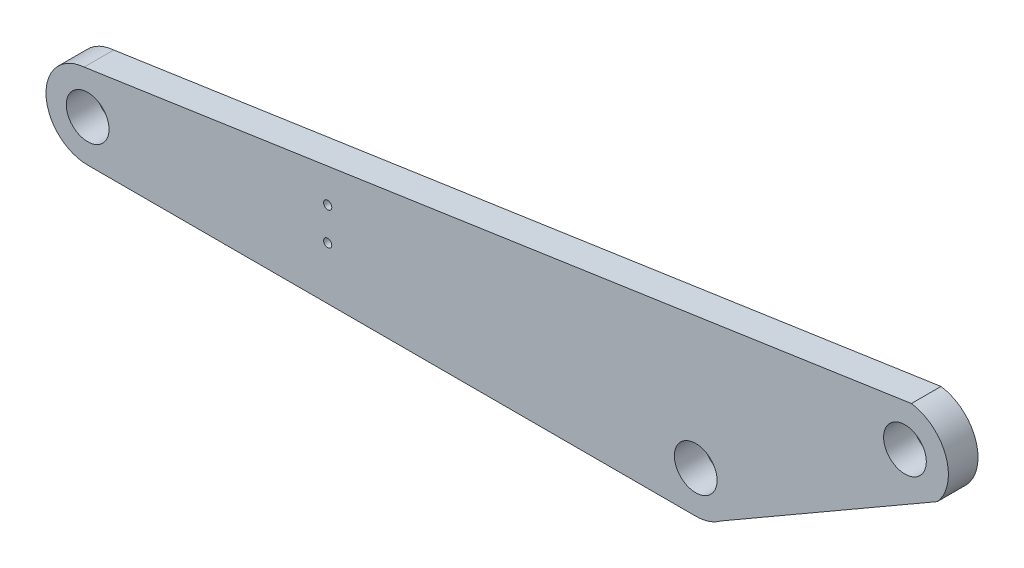
ISO-10303-21;
HEADER;
FILE_DESCRIPTION(('STEP AP214'),'2;1');
FILE_NAME('part.step','',(''),(''),'','','');
FILE_SCHEMA(('AUTOMOTIVE_DESIGN { 1 0 10303 214 1 1 1 1 }'));
ENDSEC;
DATA;
#1=APPLICATION_CONTEXT('core data for automotive mechanical design processes');
#2=APPLICATION_PROTOCOL_DEFINITION('international standard','automotive_design',2000,#1);
#3=PRODUCT_CONTEXT('',#1,'mechanical');
#4=PRODUCT('Part','Part','',(#3));
#5=PRODUCT_RELATED_PRODUCT_CATEGORY('part','',(#4));
#6=PRODUCT_DEFINITION_FORMATION('','',#4);
#7=PRODUCT_DEFINITION_CONTEXT('part definition',#1,'design');
#8=PRODUCT_DEFINITION('design','',#6,#7);
#9=PRODUCT_DEFINITION_SHAPE('','',#8);
#10=(LENGTH_UNIT() NAMED_UNIT(*) SI_UNIT(.MILLI.,.METRE.));
#11=(NAMED_UNIT(*) PLANE_ANGLE_UNIT() SI_UNIT($,.RADIAN.));
#12=(NAMED_UNIT(*) SI_UNIT($,.STERADIAN.) SOLID_ANGLE_UNIT());
#13=UNCERTAINTY_MEASURE_WITH_UNIT(LENGTH_MEASURE(1.E-05),#10,'distance_accuracy_value','');
#14=(GEOMETRIC_REPRESENTATION_CONTEXT(3) GLOBAL_UNCERTAINTY_ASSIGNED_CONTEXT((#13)) GLOBAL_UNIT_ASSIGNED_CONTEXT((#10,
#11,#12)) REPRESENTATION_CONTEXT('',''));
#15=CARTESIAN_POINT('',(0.,0.,0.));
#16=DIRECTION('',(0.,0.,1.));
#17=DIRECTION('',(1.,0.,0.));
#18=AXIS2_PLACEMENT_3D('',#15,#16,#17);
#19=CARTESIAN_POINT('',(127.305734356312,73.5000000000002,18.));
#20=DIRECTION('',(0.,0.,1.));
#21=DIRECTION('',(1.,0.,0.));
#22=AXIS2_PLACEMENT_3D('',#19,#20,#21);
#23=PLANE('',#22);
#24=CARTESIAN_POINT('',(-223.959522935687,6.65563285928387,18.));
#25=DIRECTION('',(0.,0.,1.));
#26=DIRECTION('',(1.,0.,0.));
#27=AXIS2_PLACEMENT_3D('',#24,#25,#26);
#28=CIRCLE('',#27,2.5);
#29=CARTESIAN_POINT('',(-221.459522935687,6.65563285928387,18.));
#30=VERTEX_POINT('',#29);
#31=EDGE_CURVE('E195',#30,#30,#28,.T.);
#32=ORIENTED_EDGE('',*,*,#31,.F.);
#33=EDGE_LOOP('',(#32));
#34=FACE_BOUND('',#33,.T.);
#35=CARTESIAN_POINT('',(127.305734356312,73.5000000000002,18.));
#36=DIRECTION('',(0.,0.,1.));
#37=DIRECTION('',(1.,0.,0.));
#38=AXIS2_PLACEMENT_3D('',#35,#36,#37);
#39=CIRCLE('',#38,13.);
#40=CARTESIAN_POINT('',(140.305734356312,73.5000000000002,18.));
#41=VERTEX_POINT('',#40);
#42=EDGE_CURVE('E207',#41,#41,#39,.T.);
#43=ORIENTED_EDGE('',*,*,#42,.F.);
#44=EDGE_LOOP('',(#43));
#45=FACE_BOUND('',#44,.T.);
#46=CARTESIAN_POINT('',(127.305734356312,73.5000000000002,18.));
#47=DIRECTION('',(0.,0.,1.));
#48=DIRECTION('',(1.,0.,0.));
#49=AXIS2_PLACEMENT_3D('',#46,#47,#48);
#50=CIRCLE('',#49,26.450565349214);
#51=CARTESIAN_POINT('',(146.950608565952,55.7881021745137,18.));
#52=VERTEX_POINT('',#51);
#53=CARTESIAN_POINT('',(131.250734202599,99.6547200999331,18.));
#54=VERTEX_POINT('',#53);
#55=EDGE_CURVE('E131',#52,#54,#50,.T.);
#56=ORIENTED_EDGE('',*,*,#55,.T.);
#57=DIRECTION('',(-0.989253846671343,-0.146208162719974,0.));
#58=VECTOR('',#57,1.);
#59=CARTESIAN_POINT('',(131.250734202599,99.6547200999331,18.));
#60=LINE('',#59,#58);
#61=CARTESIAN_POINT('',(-372.14308414375,25.2549231694854,18.));
#62=VERTEX_POINT('',#61);
#63=EDGE_CURVE('E89',#54,#62,#60,.T.);
#64=ORIENTED_EDGE('',*,*,#63,.T.);
#65=CARTESIAN_POINT('',(-370.,0.,18.));
#66=DIRECTION('',(0.,0.,1.));
#67=DIRECTION('',(1.,0.,0.));
#68=AXIS2_PLACEMENT_3D('',#65,#66,#67);
#69=CIRCLE('',#68,25.3456890603472);
#70=CARTESIAN_POINT('',(-369.741140616565,-25.3443671407162,18.));
#71=VERTEX_POINT('',#70);
#72=EDGE_CURVE('E102',#62,#71,#69,.T.);
#73=ORIENTED_EDGE('',*,*,#72,.T.);
#74=DIRECTION('',(1.,0.,0.));
#75=VECTOR('',#74,1.);
#76=CARTESIAN_POINT('',(-0.588044699082338,-25.3443671407161,18.));
#77=LINE('',#76,#75);
#78=CARTESIAN_POINT('',(-0.588044699082338,-25.3443671407161,18.));
#79=VERTEX_POINT('',#78);
#80=EDGE_CURVE('E96',#71,#79,#77,.T.);
#81=ORIENTED_EDGE('',*,*,#80,.T.);
#82=CARTESIAN_POINT('',(0.,0.,18.));
#83=DIRECTION('',(0.,0.,1.));
#84=DIRECTION('',(1.,0.,0.));
#85=AXIS2_PLACEMENT_3D('',#82,#83,#84);
#86=CIRCLE('',#85,25.3511881838214);
#87=CARTESIAN_POINT('',(15.2621827740877,-20.2422459055775,18.));
#88=VERTEX_POINT('',#87);
#89=EDGE_CURVE('E100',#79,#88,#86,.T.);
#90=ORIENTED_EDGE('',*,*,#89,.T.);
#91=DIRECTION('',(0.866025403784438,0.500000000000001,0.));
#92=VECTOR('',#91,1.);
#93=CARTESIAN_POINT('',(15.2621827740876,-20.2422459055775,18.));
#94=LINE('',#93,#92);
#95=EDGE_CURVE('E52',#88,#52,#94,.T.);
#96=ORIENTED_EDGE('',*,*,#95,.T.);
#97=EDGE_LOOP('',(#56,#64,#73,#81,#90,#96));
#98=FACE_BOUND('',#97,.T.);
#99=CARTESIAN_POINT('',(-370.,0.,18.));
#100=DIRECTION('',(0.,0.,1.));
#101=DIRECTION('',(1.,0.,0.));
#102=AXIS2_PLACEMENT_3D('',#99,#100,#101);
#103=CIRCLE('',#102,13.);
#104=CARTESIAN_POINT('',(-357.,0.,18.));
#105=VERTEX_POINT('',#104);
#106=EDGE_CURVE('E124',#105,#105,#103,.T.);
#107=ORIENTED_EDGE('',*,*,#106,.F.);
#108=EDGE_LOOP('',(#107));
#109=FACE_BOUND('',#108,.T.);
#110=CARTESIAN_POINT('',(0.,0.,18.));
#111=DIRECTION('',(0.,0.,1.));
#112=DIRECTION('',(1.,0.,0.));
#113=AXIS2_PLACEMENT_3D('',#110,#111,#112);
#114=CIRCLE('',#113,13.);
#115=CARTESIAN_POINT('',(13.,0.,18.));
#116=VERTEX_POINT('',#115);
#117=EDGE_CURVE('E201',#116,#116,#114,.T.);
#118=ORIENTED_EDGE('',*,*,#117,.F.);
#119=EDGE_LOOP('',(#118));
#120=FACE_BOUND('',#119,.T.);
#121=CARTESIAN_POINT('',(-223.959522935687,26.6556328592839,18.));
#122=DIRECTION('',(0.,0.,1.));
#123=DIRECTION('',(1.,0.,0.));
#124=AXIS2_PLACEMENT_3D('',#121,#122,#123);
#125=CIRCLE('',#124,2.5);
#126=CARTESIAN_POINT('',(-221.459522935687,26.6556328592839,18.));
#127=VERTEX_POINT('',#126);
#128=EDGE_CURVE('E186',#127,#127,#125,.T.);
#129=ORIENTED_EDGE('',*,*,#128,.F.);
#130=EDGE_LOOP('',(#129));
#131=FACE_BOUND('',#130,.T.);
#132=ADVANCED_FACE('F35',(#34,#45,#98,#109,#120,#131),#23,.T.);
#133=CARTESIAN_POINT('',(127.305734356312,73.5000000000002,0.));
#134=DIRECTION('',(0.,0.,1.));
#135=DIRECTION('',(1.,0.,0.));
#136=AXIS2_PLACEMENT_3D('',#133,#134,#135);
#137=PLANE('',#136);
#138=CARTESIAN_POINT('',(127.305734356312,73.5000000000002,0.));
#139=DIRECTION('',(0.,0.,1.));
#140=DIRECTION('',(1.,0.,0.));
#141=AXIS2_PLACEMENT_3D('',#138,#139,#140);
#142=CIRCLE('',#141,26.450565349214);
#143=CARTESIAN_POINT('',(146.950608565952,55.7881021745137,0.));
#144=VERTEX_POINT('',#143);
#145=CARTESIAN_POINT('',(131.250734202599,99.6547200999331,0.));
#146=VERTEX_POINT('',#145);
#147=EDGE_CURVE('E120',#144,#146,#142,.T.);
#148=ORIENTED_EDGE('',*,*,#147,.F.);
#149=DIRECTION('',(0.866025403784438,0.500000000000001,0.));
#150=VECTOR('',#149,1.);
#151=CARTESIAN_POINT('',(15.2621827740876,-20.2422459055775,0.));
#152=LINE('',#151,#150);
#153=CARTESIAN_POINT('',(15.2621827740877,-20.2422459055775,0.));
#154=VERTEX_POINT('',#153);
#155=EDGE_CURVE('E81',#154,#144,#152,.T.);
#156=ORIENTED_EDGE('',*,*,#155,.F.);
#157=CARTESIAN_POINT('',(0.,0.,0.));
#158=DIRECTION('',(0.,0.,1.));
#159=DIRECTION('',(1.,0.,0.));
#160=AXIS2_PLACEMENT_3D('',#157,#158,#159);
#161=CIRCLE('',#160,25.3511881838214);
#162=CARTESIAN_POINT('',(-0.588044699082338,-25.3443671407161,0.));
#163=VERTEX_POINT('',#162);
#164=EDGE_CURVE('E75',#163,#154,#161,.T.);
#165=ORIENTED_EDGE('',*,*,#164,.F.);
#166=DIRECTION('',(1.,0.,0.));
#167=VECTOR('',#166,1.);
#168=CARTESIAN_POINT('',(-0.588044699082338,-25.3443671407161,0.));
#169=LINE('',#168,#167);
#170=CARTESIAN_POINT('',(-369.741140616565,-25.3443671407162,0.));
#171=VERTEX_POINT('',#170);
#172=EDGE_CURVE('E110',#171,#163,#169,.T.);
#173=ORIENTED_EDGE('',*,*,#172,.F.);
#174=CARTESIAN_POINT('',(-370.,0.,0.));
#175=DIRECTION('',(0.,0.,1.));
#176=DIRECTION('',(1.,0.,0.));
#177=AXIS2_PLACEMENT_3D('',#174,#175,#176);
#178=CIRCLE('',#177,25.3456890603472);
#179=CARTESIAN_POINT('',(-372.14308414375,25.2549231694854,0.));
#180=VERTEX_POINT('',#179);
#181=EDGE_CURVE('E126',#180,#171,#178,.T.);
#182=ORIENTED_EDGE('',*,*,#181,.F.);
#183=DIRECTION('',(-0.989253846671343,-0.146208162719974,0.));
#184=VECTOR('',#183,1.);
#185=CARTESIAN_POINT('',(131.250734202599,99.6547200999331,0.));
#186=LINE('',#185,#184);
#187=EDGE_CURVE('E123',#146,#180,#186,.T.);
#188=ORIENTED_EDGE('',*,*,#187,.F.);
#189=EDGE_LOOP('',(#148,#156,#165,#173,#182,#188));
#190=FACE_BOUND('',#189,.T.);
#191=CARTESIAN_POINT('',(-370.,0.,0.));
#192=DIRECTION('',(0.,0.,1.));
#193=DIRECTION('',(1.,0.,0.));
#194=AXIS2_PLACEMENT_3D('',#191,#192,#193);
#195=CIRCLE('',#194,13.);
#196=CARTESIAN_POINT('',(-357.,0.,0.));
#197=VERTEX_POINT('',#196);
#198=EDGE_CURVE('E210',#197,#197,#195,.T.);
#199=ORIENTED_EDGE('',*,*,#198,.T.);
#200=EDGE_LOOP('',(#199));
#201=FACE_BOUND('',#200,.T.);
#202=CARTESIAN_POINT('',(127.305734356312,73.5000000000002,0.));
#203=DIRECTION('',(0.,0.,1.));
#204=DIRECTION('',(1.,0.,0.));
#205=AXIS2_PLACEMENT_3D('',#202,#203,#204);
#206=CIRCLE('',#205,13.);
#207=CARTESIAN_POINT('',(140.305734356312,73.5000000000002,0.));
#208=VERTEX_POINT('',#207);
#209=EDGE_CURVE('E204',#208,#208,#206,.T.);
#210=ORIENTED_EDGE('',*,*,#209,.T.);
#211=EDGE_LOOP('',(#210));
#212=FACE_BOUND('',#211,.T.);
#213=CARTESIAN_POINT('',(0.,0.,0.));
#214=DIRECTION('',(0.,0.,1.));
#215=DIRECTION('',(1.,0.,0.));
#216=AXIS2_PLACEMENT_3D('',#213,#214,#215);
#217=CIRCLE('',#216,13.);
#218=CARTESIAN_POINT('',(13.,0.,0.));
#219=VERTEX_POINT('',#218);
#220=EDGE_CURVE('E198',#219,#219,#217,.T.);
#221=ORIENTED_EDGE('',*,*,#220,.T.);
#222=EDGE_LOOP('',(#221));
#223=FACE_BOUND('',#222,.T.);
#224=CARTESIAN_POINT('',(-223.959522935687,6.65563285928387,0.));
#225=DIRECTION('',(0.,0.,1.));
#226=DIRECTION('',(1.,0.,0.));
#227=AXIS2_PLACEMENT_3D('',#224,#225,#226);
#228=CIRCLE('',#227,2.5);
#229=CARTESIAN_POINT('',(-221.459522935687,6.65563285928387,0.));
#230=VERTEX_POINT('',#229);
#231=EDGE_CURVE('E192',#230,#230,#228,.T.);
#232=ORIENTED_EDGE('',*,*,#231,.T.);
#233=EDGE_LOOP('',(#232));
#234=FACE_BOUND('',#233,.T.);
#235=CARTESIAN_POINT('',(-223.959522935687,26.6556328592839,0.));
#236=DIRECTION('',(0.,0.,1.));
#237=DIRECTION('',(1.,0.,0.));
#238=AXIS2_PLACEMENT_3D('',#235,#236,#237);
#239=CIRCLE('',#238,2.5);
#240=CARTESIAN_POINT('',(-221.459522935687,26.6556328592839,0.));
#241=VERTEX_POINT('',#240);
#242=EDGE_CURVE('E189',#241,#241,#239,.T.);
#243=ORIENTED_EDGE('',*,*,#242,.T.);
#244=EDGE_LOOP('',(#243));
#245=FACE_BOUND('',#244,.T.);
#246=ADVANCED_FACE('F140',(#190,#201,#212,#223,#234,#245),#137,.F.);
#247=CARTESIAN_POINT('',(127.305734356312,73.5000000000002,18.));
#248=DIRECTION('',(0.,0.,-1.));
#249=DIRECTION('',(-1.,0.,0.));
#250=AXIS2_PLACEMENT_3D('',#247,#248,#249);
#251=CYLINDRICAL_SURFACE('',#250,26.450565349214);
#252=ORIENTED_EDGE('',*,*,#147,.T.);
#253=DIRECTION('',(0.,0.,-1.));
#254=VECTOR('',#253,1.);
#255=CARTESIAN_POINT('',(131.250734202599,99.6547200999331,18.));
#256=LINE('',#255,#254);
#257=EDGE_CURVE('E11',#54,#146,#256,.T.);
#258=ORIENTED_EDGE('',*,*,#257,.F.);
#259=ORIENTED_EDGE('',*,*,#55,.F.);
#260=DIRECTION('',(0.,0.,-1.));
#261=VECTOR('',#260,1.);
#262=CARTESIAN_POINT('',(146.950608565952,55.7881021745137,18.));
#263=LINE('',#262,#261);
#264=EDGE_CURVE('E116',#52,#144,#263,.T.);
#265=ORIENTED_EDGE('',*,*,#264,.T.);
#266=EDGE_LOOP('',(#252,#258,#259,#265));
#267=FACE_BOUND('',#266,.T.);
#268=ADVANCED_FACE('F37',(#267),#251,.T.);
#269=CARTESIAN_POINT('',(131.250734202599,99.6547200999331,18.));
#270=DIRECTION('',(0.146208162719974,-0.989253846671343,0.));
#271=DIRECTION('',(0.989253846671343,0.146208162719974,0.));
#272=AXIS2_PLACEMENT_3D('',#269,#270,#271);
#273=PLANE('',#272);
#274=ORIENTED_EDGE('',*,*,#187,.T.);
#275=DIRECTION('',(0.,0.,-1.));
#276=VECTOR('',#275,1.);
#277=CARTESIAN_POINT('',(-372.14308414375,25.2549231694854,18.));
#278=LINE('',#277,#276);
#279=EDGE_CURVE('E44',#62,#180,#278,.T.);
#280=ORIENTED_EDGE('',*,*,#279,.F.);
#281=ORIENTED_EDGE('',*,*,#63,.F.);
#282=ORIENTED_EDGE('',*,*,#257,.T.);
#283=EDGE_LOOP('',(#274,#280,#281,#282));
#284=FACE_BOUND('',#283,.T.);
#285=ADVANCED_FACE('F277',(#284),#273,.F.);
#286=CARTESIAN_POINT('',(-370.,0.,18.));
#287=DIRECTION('',(0.,0.,-1.));
#288=DIRECTION('',(-1.,0.,0.));
#289=AXIS2_PLACEMENT_3D('',#286,#287,#288);
#290=CYLINDRICAL_SURFACE('',#289,25.3456890603472);
#291=ORIENTED_EDGE('',*,*,#181,.T.);
#292=DIRECTION('',(0.,0.,-1.));
#293=VECTOR('',#292,1.);
#294=CARTESIAN_POINT('',(-369.741140616565,-25.3443671407162,18.));
#295=LINE('',#294,#293);
#296=EDGE_CURVE('E111',#71,#171,#295,.T.);
#297=ORIENTED_EDGE('',*,*,#296,.F.);
#298=ORIENTED_EDGE('',*,*,#72,.F.);
#299=ORIENTED_EDGE('',*,*,#279,.T.);
#300=EDGE_LOOP('',(#291,#297,#298,#299));
#301=FACE_BOUND('',#300,.T.);
#302=ADVANCED_FACE('F137',(#301),#290,.T.);
#303=CARTESIAN_POINT('',(-0.588044699082338,-25.3443671407161,18.));
#304=DIRECTION('',(0.,1.,0.));
#305=DIRECTION('',(-1.,0.,0.));
#306=AXIS2_PLACEMENT_3D('',#303,#304,#305);
#307=PLANE('',#306);
#308=ORIENTED_EDGE('',*,*,#172,.T.);
#309=DIRECTION('',(0.,0.,-1.));
#310=VECTOR('',#309,1.);
#311=CARTESIAN_POINT('',(-0.588044699082338,-25.3443671407161,18.));
#312=LINE('',#311,#310);
#313=EDGE_CURVE('E107',#79,#163,#312,.T.);
#314=ORIENTED_EDGE('',*,*,#313,.F.);
#315=ORIENTED_EDGE('',*,*,#80,.F.);
#316=ORIENTED_EDGE('',*,*,#296,.T.);
#317=EDGE_LOOP('',(#308,#314,#315,#316));
#318=FACE_BOUND('',#317,.T.);
#319=ADVANCED_FACE('F108',(#318),#307,.F.);
#320=CARTESIAN_POINT('',(0.,0.,18.));
#321=DIRECTION('',(0.,0.,-1.));
#322=DIRECTION('',(-1.,0.,0.));
#323=AXIS2_PLACEMENT_3D('',#320,#321,#322);
#324=CYLINDRICAL_SURFACE('',#323,25.3511881838214);
#325=ORIENTED_EDGE('',*,*,#164,.T.);
#326=DIRECTION('',(0.,0.,-1.));
#327=VECTOR('',#326,1.);
#328=CARTESIAN_POINT('',(15.2621827740877,-20.2422459055775,18.));
#329=LINE('',#328,#327);
#330=EDGE_CURVE('E112',#88,#154,#329,.T.);
#331=ORIENTED_EDGE('',*,*,#330,.F.);
#332=ORIENTED_EDGE('',*,*,#89,.F.);
#333=ORIENTED_EDGE('',*,*,#313,.T.);
#334=EDGE_LOOP('',(#325,#331,#332,#333));
#335=FACE_BOUND('',#334,.T.);
#336=ADVANCED_FACE('F114',(#335),#324,.T.);
#337=CARTESIAN_POINT('',(15.2621827740876,-20.2422459055775,18.));
#338=DIRECTION('',(-0.500000000000001,0.866025403784438,0.));
#339=DIRECTION('',(-0.866025403784438,-0.500000000000001,0.));
#340=AXIS2_PLACEMENT_3D('',#337,#338,#339);
#341=PLANE('',#340);
#342=ORIENTED_EDGE('',*,*,#155,.T.);
#343=ORIENTED_EDGE('',*,*,#264,.F.);
#344=ORIENTED_EDGE('',*,*,#95,.F.);
#345=ORIENTED_EDGE('',*,*,#330,.T.);
#346=EDGE_LOOP('',(#342,#343,#344,#345));
#347=FACE_BOUND('',#346,.T.);
#348=ADVANCED_FACE('F145',(#347),#341,.F.);
#349=CARTESIAN_POINT('',(-370.,0.,18.));
#350=DIRECTION('',(0.,0.,-1.));
#351=DIRECTION('',(-1.,0.,0.));
#352=AXIS2_PLACEMENT_3D('',#349,#350,#351);
#353=CYLINDRICAL_SURFACE('',#352,13.);
#354=ORIENTED_EDGE('',*,*,#106,.T.);
#355=EDGE_LOOP('',(#354));
#356=FACE_BOUND('',#355,.T.);
#357=ORIENTED_EDGE('',*,*,#198,.F.);
#358=EDGE_LOOP('',(#357));
#359=FACE_BOUND('',#358,.T.);
#360=ADVANCED_FACE('F147',(#356,#359),#353,.F.);
#361=CARTESIAN_POINT('',(127.305734356312,73.5000000000002,18.));
#362=DIRECTION('',(0.,0.,-1.));
#363=DIRECTION('',(-1.,0.,0.));
#364=AXIS2_PLACEMENT_3D('',#361,#362,#363);
#365=CYLINDRICAL_SURFACE('',#364,13.);
#366=ORIENTED_EDGE('',*,*,#42,.T.);
#367=EDGE_LOOP('',(#366));
#368=FACE_BOUND('',#367,.T.);
#369=ORIENTED_EDGE('',*,*,#209,.F.);
#370=EDGE_LOOP('',(#369));
#371=FACE_BOUND('',#370,.T.);
#372=ADVANCED_FACE('F153',(#368,#371),#365,.F.);
#373=CARTESIAN_POINT('',(0.,0.,18.));
#374=DIRECTION('',(0.,0.,-1.));
#375=DIRECTION('',(-1.,0.,0.));
#376=AXIS2_PLACEMENT_3D('',#373,#374,#375);
#377=CYLINDRICAL_SURFACE('',#376,13.);
#378=ORIENTED_EDGE('',*,*,#117,.T.);
#379=EDGE_LOOP('',(#378));
#380=FACE_BOUND('',#379,.T.);
#381=ORIENTED_EDGE('',*,*,#220,.F.);
#382=EDGE_LOOP('',(#381));
#383=FACE_BOUND('',#382,.T.);
#384=ADVANCED_FACE('F169',(#380,#383),#377,.F.);
#385=CARTESIAN_POINT('',(-223.959522935687,6.65563285928387,18.));
#386=DIRECTION('',(0.,0.,-1.));
#387=DIRECTION('',(-1.,0.,0.));
#388=AXIS2_PLACEMENT_3D('',#385,#386,#387);
#389=CYLINDRICAL_SURFACE('',#388,2.5);
#390=ORIENTED_EDGE('',*,*,#31,.T.);
#391=EDGE_LOOP('',(#390));
#392=FACE_BOUND('',#391,.T.);
#393=ORIENTED_EDGE('',*,*,#231,.F.);
#394=EDGE_LOOP('',(#393));
#395=FACE_BOUND('',#394,.T.);
#396=ADVANCED_FACE('F173',(#392,#395),#389,.F.);
#397=CARTESIAN_POINT('',(-223.959522935687,26.6556328592839,18.));
#398=DIRECTION('',(0.,0.,-1.));
#399=DIRECTION('',(-1.,0.,0.));
#400=AXIS2_PLACEMENT_3D('',#397,#398,#399);
#401=CYLINDRICAL_SURFACE('',#400,2.5);
#402=ORIENTED_EDGE('',*,*,#128,.T.);
#403=EDGE_LOOP('',(#402));
#404=FACE_BOUND('',#403,.T.);
#405=ORIENTED_EDGE('',*,*,#242,.F.);
#406=EDGE_LOOP('',(#405));
#407=FACE_BOUND('',#406,.T.);
#408=ADVANCED_FACE('F177',(#404,#407),#401,.F.);
#409=CLOSED_SHELL('',(#132,#246,#268,#285,#302,#319,#336,#348,#360,#372,#384,#396,#408));
#410=MANIFOLD_SOLID_BREP('B2',#409);
#411=ADVANCED_BREP_SHAPE_REPRESENTATION('',(#18,#410),#14);
#412=SHAPE_DEFINITION_REPRESENTATION(#9,#411);
ENDSEC;
END-ISO-10303-21;
